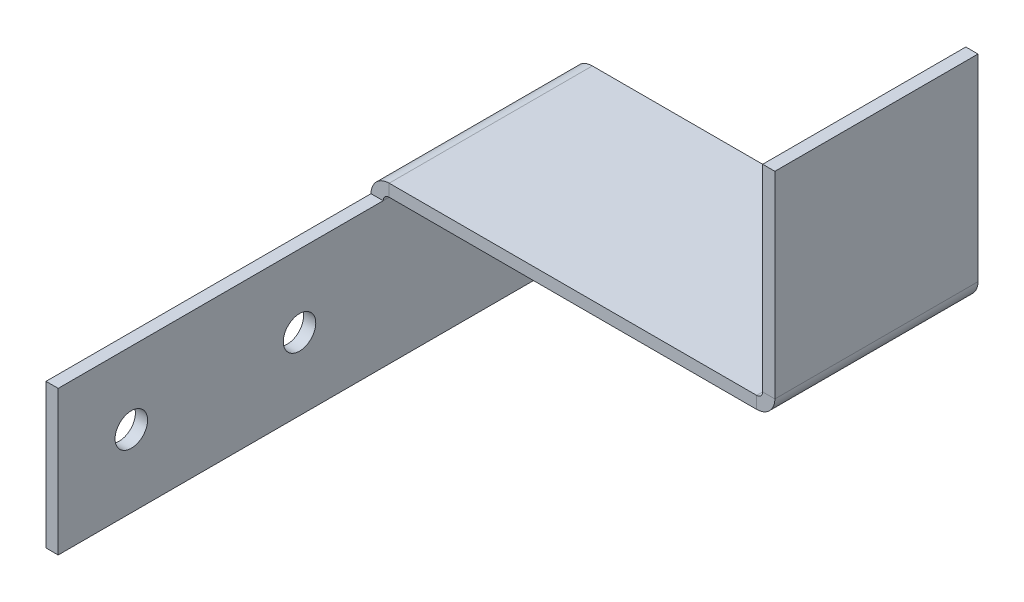
ISO-10303-21;
HEADER;
FILE_DESCRIPTION(('STEP AP214'),'2;1');
FILE_NAME('part.step','',(''),(''),'','','');
FILE_SCHEMA(('AUTOMOTIVE_DESIGN { 1 0 10303 214 1 1 1 1 }'));
ENDSEC;
DATA;
#1=APPLICATION_CONTEXT('core data for automotive mechanical design processes');
#2=APPLICATION_PROTOCOL_DEFINITION('international standard','automotive_design',2000,#1);
#3=PRODUCT_CONTEXT('',#1,'mechanical');
#4=PRODUCT('Part','Part','',(#3));
#5=PRODUCT_RELATED_PRODUCT_CATEGORY('part','',(#4));
#6=PRODUCT_DEFINITION_FORMATION('','',#4);
#7=PRODUCT_DEFINITION_CONTEXT('part definition',#1,'design');
#8=PRODUCT_DEFINITION('design','',#6,#7);
#9=PRODUCT_DEFINITION_SHAPE('','',#8);
#10=(LENGTH_UNIT() NAMED_UNIT(*) SI_UNIT(.MILLI.,.METRE.));
#11=(NAMED_UNIT(*) PLANE_ANGLE_UNIT() SI_UNIT($,.RADIAN.));
#12=(NAMED_UNIT(*) SI_UNIT($,.STERADIAN.) SOLID_ANGLE_UNIT());
#13=UNCERTAINTY_MEASURE_WITH_UNIT(LENGTH_MEASURE(1.E-05),#10,'distance_accuracy_value','');
#14=(GEOMETRIC_REPRESENTATION_CONTEXT(3) GLOBAL_UNCERTAINTY_ASSIGNED_CONTEXT((#13)) GLOBAL_UNIT_ASSIGNED_CONTEXT((#10,
#11,#12)) REPRESENTATION_CONTEXT('',''));
#15=CARTESIAN_POINT('',(0.,0.,0.));
#16=DIRECTION('',(0.,0.,1.));
#17=DIRECTION('',(1.,0.,0.));
#18=AXIS2_PLACEMENT_3D('',#15,#16,#17);
#19=CARTESIAN_POINT('',(9.99999999999997,-1.5,25.0000000000001));
#20=DIRECTION('',(0.,0.,1.));
#21=DIRECTION('',(-1.,0.,0.));
#22=AXIS2_PLACEMENT_3D('',#19,#20,#21);
#23=PLANE('',#22);
#24=DIRECTION('',(-1.,0.,0.));
#25=VECTOR('',#24,1.);
#26=CARTESIAN_POINT('',(9.99999999999997,0.,25.0000000000001));
#27=LINE('',#26,#25);
#28=CARTESIAN_POINT('',(47.4634,0.,25.0000000000001));
#29=VERTEX_POINT('',#28);
#30=CARTESIAN_POINT('',(2.23659999999993,0.,25.0000000000001));
#31=VERTEX_POINT('',#30);
#32=EDGE_CURVE('E41',#29,#31,#27,.T.);
#33=ORIENTED_EDGE('',*,*,#32,.T.);
#34=DIRECTION('',(0.,1.,0.));
#35=VECTOR('',#34,1.);
#36=CARTESIAN_POINT('',(2.23659999999994,-1.5,25.0000000000001));
#37=LINE('',#36,#35);
#38=CARTESIAN_POINT('',(2.23659999999994,-1.5,25.0000000000001));
#39=VERTEX_POINT('',#38);
#40=EDGE_CURVE('E186',#39,#31,#37,.T.);
#41=ORIENTED_EDGE('',*,*,#40,.F.);
#42=DIRECTION('',(-1.,0.,0.));
#43=VECTOR('',#42,1.);
#44=CARTESIAN_POINT('',(9.99999999999997,-1.5,25.0000000000001));
#45=LINE('',#44,#43);
#46=CARTESIAN_POINT('',(47.4634,-1.5,25.0000000000001));
#47=VERTEX_POINT('',#46);
#48=EDGE_CURVE('E46',#47,#39,#45,.T.);
#49=ORIENTED_EDGE('',*,*,#48,.F.);
#50=DIRECTION('',(0.,-1.,0.));
#51=VECTOR('',#50,1.);
#52=CARTESIAN_POINT('',(47.4634,0.,25.0000000000001));
#53=LINE('',#52,#51);
#54=EDGE_CURVE('E199',#29,#47,#53,.T.);
#55=ORIENTED_EDGE('',*,*,#54,.F.);
#56=EDGE_LOOP('',(#33,#41,#49,#55));
#57=FACE_BOUND('',#56,.T.);
#58=ADVANCED_FACE('F37',(#57),#23,.T.);
#59=CARTESIAN_POINT('',(0.,-1.5,0.));
#60=DIRECTION('',(0.,1.,0.));
#61=DIRECTION('',(0.,0.,-1.));
#62=AXIS2_PLACEMENT_3D('',#59,#60,#61);
#63=PLANE('',#62);
#64=DIRECTION('',(0.,0.,1.));
#65=VECTOR('',#64,1.);
#66=CARTESIAN_POINT('',(47.4634,-1.5,25.0000000000001));
#67=LINE('',#66,#65);
#68=CARTESIAN_POINT('',(47.4634,-1.5,0.));
#69=VERTEX_POINT('',#68);
#70=EDGE_CURVE('E289',#47,#69,#67,.F.);
#71=ORIENTED_EDGE('',*,*,#70,.F.);
#72=ORIENTED_EDGE('',*,*,#48,.T.);
#73=DIRECTION('',(0.,0.,1.));
#74=VECTOR('',#73,1.);
#75=CARTESIAN_POINT('',(2.23659999999994,-1.5,25.0000000000001));
#76=LINE('',#75,#74);
#77=CARTESIAN_POINT('',(2.23659999999994,-1.5,0.));
#78=VERTEX_POINT('',#77);
#79=EDGE_CURVE('E171',#39,#78,#76,.F.);
#80=ORIENTED_EDGE('',*,*,#79,.T.);
#81=DIRECTION('',(1.,0.,0.));
#82=VECTOR('',#81,1.);
#83=CARTESIAN_POINT('',(0.,-1.5,0.));
#84=LINE('',#83,#82);
#85=EDGE_CURVE('E11',#78,#69,#84,.T.);
#86=ORIENTED_EDGE('',*,*,#85,.T.);
#87=EDGE_LOOP('',(#71,#72,#80,#86));
#88=FACE_BOUND('',#87,.T.);
#89=ADVANCED_FACE('F312',(#88),#63,.F.);
#90=CARTESIAN_POINT('',(0.,0.,0.));
#91=DIRECTION('',(0.,1.,0.));
#92=DIRECTION('',(0.,0.,-1.));
#93=AXIS2_PLACEMENT_3D('',#90,#91,#92);
#94=PLANE('',#93);
#95=DIRECTION('',(1.,0.,0.));
#96=VECTOR('',#95,1.);
#97=CARTESIAN_POINT('',(0.,0.,0.));
#98=LINE('',#97,#96);
#99=CARTESIAN_POINT('',(2.23659999999994,0.,0.));
#100=VERTEX_POINT('',#99);
#101=CARTESIAN_POINT('',(47.4634,0.,0.));
#102=VERTEX_POINT('',#101);
#103=EDGE_CURVE('E185',#100,#102,#98,.T.);
#104=ORIENTED_EDGE('',*,*,#103,.F.);
#105=DIRECTION('',(0.,0.,1.));
#106=VECTOR('',#105,1.);
#107=CARTESIAN_POINT('',(2.23659999999993,0.,25.0000000000001));
#108=LINE('',#107,#106);
#109=EDGE_CURVE('E206',#31,#100,#108,.F.);
#110=ORIENTED_EDGE('',*,*,#109,.F.);
#111=ORIENTED_EDGE('',*,*,#32,.F.);
#112=DIRECTION('',(0.,0.,1.));
#113=VECTOR('',#112,1.);
#114=CARTESIAN_POINT('',(47.4634,0.,25.0000000000001));
#115=LINE('',#114,#113);
#116=EDGE_CURVE('E204',#29,#102,#115,.F.);
#117=ORIENTED_EDGE('',*,*,#116,.T.);
#118=EDGE_LOOP('',(#104,#110,#111,#117));
#119=FACE_BOUND('',#118,.T.);
#120=ADVANCED_FACE('F203',(#119),#94,.T.);
#121=CARTESIAN_POINT('',(0.,-1.5,0.));
#122=DIRECTION('',(0.,0.,-1.));
#123=DIRECTION('',(1.,0.,0.));
#124=AXIS2_PLACEMENT_3D('',#121,#122,#123);
#125=PLANE('',#124);
#126=DIRECTION('',(0.,-1.,0.));
#127=VECTOR('',#126,1.);
#128=CARTESIAN_POINT('',(47.4634,0.,0.));
#129=LINE('',#128,#127);
#130=EDGE_CURVE('E225',#102,#69,#129,.T.);
#131=ORIENTED_EDGE('',*,*,#130,.T.);
#132=ORIENTED_EDGE('',*,*,#85,.F.);
#133=DIRECTION('',(0.,1.,0.));
#134=VECTOR('',#133,1.);
#135=CARTESIAN_POINT('',(2.23659999999994,-1.5,0.));
#136=LINE('',#135,#134);
#137=EDGE_CURVE('E182',#78,#100,#136,.T.);
#138=ORIENTED_EDGE('',*,*,#137,.T.);
#139=ORIENTED_EDGE('',*,*,#103,.T.);
#140=EDGE_LOOP('',(#131,#132,#138,#139));
#141=FACE_BOUND('',#140,.T.);
#142=ADVANCED_FACE('F39',(#141),#125,.T.);
#143=CARTESIAN_POINT('',(2.23659999999994,-2.2366,0.));
#144=DIRECTION('',(0.,0.,-1.));
#145=DIRECTION('',(1.,0.,0.));
#146=AXIS2_PLACEMENT_3D('',#143,#144,#145);
#147=PLANE('',#146);
#148=DIRECTION('',(-1.,0.,0.));
#149=VECTOR('',#148,1.);
#150=CARTESIAN_POINT('',(0.,-2.23659999999999,0.));
#151=LINE('',#150,#149);
#152=CARTESIAN_POINT('',(1.49999999999994,-2.2366,0.));
#153=VERTEX_POINT('',#152);
#154=CARTESIAN_POINT('',(0.,-2.23659999999999,0.));
#155=VERTEX_POINT('',#154);
#156=EDGE_CURVE('E159',#153,#155,#151,.T.);
#157=ORIENTED_EDGE('',*,*,#156,.T.);
#158=CARTESIAN_POINT('',(2.23659999999994,-2.2366,0.));
#159=DIRECTION('',(0.,0.,-1.));
#160=DIRECTION('',(-1.,0.,0.));
#161=AXIS2_PLACEMENT_3D('',#158,#159,#160);
#162=CIRCLE('',#161,2.2366);
#163=EDGE_CURVE('E188',#100,#155,#162,.F.);
#164=ORIENTED_EDGE('',*,*,#163,.F.);
#165=ORIENTED_EDGE('',*,*,#137,.F.);
#166=CARTESIAN_POINT('',(2.23659999999994,-2.2366,0.));
#167=DIRECTION('',(0.,0.,-1.));
#168=DIRECTION('',(-1.,0.,0.));
#169=AXIS2_PLACEMENT_3D('',#166,#167,#168);
#170=CIRCLE('',#169,0.736599999999999);
#171=EDGE_CURVE('E175',#78,#153,#170,.F.);
#172=ORIENTED_EDGE('',*,*,#171,.T.);
#173=EDGE_LOOP('',(#157,#164,#165,#172));
#174=FACE_BOUND('',#173,.T.);
#175=ADVANCED_FACE('F217',(#174),#147,.T.);
#176=CARTESIAN_POINT('',(2.23659999999994,-2.2366,25.0000000000001));
#177=DIRECTION('',(0.,0.,-1.));
#178=DIRECTION('',(1.,0.,0.));
#179=AXIS2_PLACEMENT_3D('',#176,#177,#178);
#180=PLANE('',#179);
#181=CARTESIAN_POINT('',(2.23659999999994,-2.2366,25.0000000000001));
#182=DIRECTION('',(0.,0.,-1.));
#183=DIRECTION('',(-1.,0.,0.));
#184=AXIS2_PLACEMENT_3D('',#181,#182,#183);
#185=CIRCLE('',#184,0.736599999999999);
#186=CARTESIAN_POINT('',(1.49999999999999,-2.2366,25.0000000000001));
#187=VERTEX_POINT('',#186);
#188=EDGE_CURVE('E164',#187,#39,#185,.T.);
#189=ORIENTED_EDGE('',*,*,#188,.T.);
#190=ORIENTED_EDGE('',*,*,#40,.T.);
#191=CARTESIAN_POINT('',(2.23659999999994,-2.2366,25.0000000000001));
#192=DIRECTION('',(0.,0.,-1.));
#193=DIRECTION('',(-1.,0.,0.));
#194=AXIS2_PLACEMENT_3D('',#191,#192,#193);
#195=CIRCLE('',#194,2.2366);
#196=CARTESIAN_POINT('',(0.,-2.23659999999999,25.0000000000001));
#197=VERTEX_POINT('',#196);
#198=EDGE_CURVE('E166',#197,#31,#195,.T.);
#199=ORIENTED_EDGE('',*,*,#198,.F.);
#200=DIRECTION('',(-1.,0.,0.));
#201=VECTOR('',#200,1.);
#202=CARTESIAN_POINT('',(1.49999999999994,-2.2366,25.0000000000001));
#203=LINE('',#202,#201);
#204=EDGE_CURVE('E142',#187,#197,#203,.T.);
#205=ORIENTED_EDGE('',*,*,#204,.F.);
#206=EDGE_LOOP('',(#189,#190,#199,#205));
#207=FACE_BOUND('',#206,.T.);
#208=ADVANCED_FACE('F162',(#207),#180,.F.);
#209=CARTESIAN_POINT('',(2.23659999999994,-2.2366,25.0000000000001));
#210=DIRECTION('',(0.,0.,1.));
#211=DIRECTION('',(-1.,0.,0.));
#212=AXIS2_PLACEMENT_3D('',#209,#210,#211);
#213=CYLINDRICAL_SURFACE('',#212,2.2366);
#214=ORIENTED_EDGE('',*,*,#109,.T.);
#215=ORIENTED_EDGE('',*,*,#163,.T.);
#216=DIRECTION('',(0.,0.,1.));
#217=VECTOR('',#216,1.);
#218=CARTESIAN_POINT('',(0.,-2.23659999999999,0.));
#219=LINE('',#218,#217);
#220=EDGE_CURVE('E167',#155,#197,#219,.T.);
#221=ORIENTED_EDGE('',*,*,#220,.T.);
#222=ORIENTED_EDGE('',*,*,#198,.T.);
#223=EDGE_LOOP('',(#214,#215,#221,#222));
#224=FACE_BOUND('',#223,.T.);
#225=ADVANCED_FACE('F240',(#224),#213,.T.);
#226=CARTESIAN_POINT('',(2.23659999999994,-2.2366,25.0000000000001));
#227=DIRECTION('',(0.,0.,1.));
#228=DIRECTION('',(-1.,0.,0.));
#229=AXIS2_PLACEMENT_3D('',#226,#227,#228);
#230=CYLINDRICAL_SURFACE('',#229,0.736599999999999);
#231=ORIENTED_EDGE('',*,*,#79,.F.);
#232=ORIENTED_EDGE('',*,*,#188,.F.);
#233=DIRECTION('',(0.,0.,-1.));
#234=VECTOR('',#233,1.);
#235=CARTESIAN_POINT('',(1.49999999999994,-2.2366,0.));
#236=LINE('',#235,#234);
#237=EDGE_CURVE('E152',#153,#187,#236,.F.);
#238=ORIENTED_EDGE('',*,*,#237,.F.);
#239=ORIENTED_EDGE('',*,*,#171,.F.);
#240=EDGE_LOOP('',(#231,#232,#238,#239));
#241=FACE_BOUND('',#240,.T.);
#242=ADVANCED_FACE('F169',(#241),#230,.F.);
#243=CARTESIAN_POINT('',(-1.23599047663348E-13,-20.,0.));
#244=DIRECTION('',(0.,0.,-1.));
#245=DIRECTION('',(1.,0.,0.));
#246=AXIS2_PLACEMENT_3D('',#243,#244,#245);
#247=PLANE('',#246);
#248=DIRECTION('',(0.,1.,0.));
#249=VECTOR('',#248,1.);
#250=CARTESIAN_POINT('',(1.49999999999995,0.,0.));
#251=LINE('',#250,#249);
#252=CARTESIAN_POINT('',(1.49999999999988,-20.,0.));
#253=VERTEX_POINT('',#252);
#254=EDGE_CURVE('E155',#153,#253,#251,.F.);
#255=ORIENTED_EDGE('',*,*,#254,.T.);
#256=DIRECTION('',(1.,0.,0.));
#257=VECTOR('',#256,1.);
#258=CARTESIAN_POINT('',(-1.23599047663348E-13,-20.,0.));
#259=LINE('',#258,#257);
#260=CARTESIAN_POINT('',(-1.23602284087743E-13,-20.,0.));
#261=VERTEX_POINT('',#260);
#262=EDGE_CURVE('E173',#261,#253,#259,.T.);
#263=ORIENTED_EDGE('',*,*,#262,.F.);
#264=DIRECTION('',(0.,-1.,0.));
#265=VECTOR('',#264,1.);
#266=CARTESIAN_POINT('',(-1.23599047663348E-13,-20.,0.));
#267=LINE('',#266,#265);
#268=EDGE_CURVE('E223',#155,#261,#267,.T.);
#269=ORIENTED_EDGE('',*,*,#268,.F.);
#270=ORIENTED_EDGE('',*,*,#156,.F.);
#271=EDGE_LOOP('',(#255,#263,#269,#270));
#272=FACE_BOUND('',#271,.T.);
#273=ADVANCED_FACE('F220',(#272),#247,.T.);
#274=CARTESIAN_POINT('',(0.,0.,0.));
#275=DIRECTION('',(-1.,0.,0.));
#276=DIRECTION('',(0.,-1.,0.));
#277=AXIS2_PLACEMENT_3D('',#274,#275,#276);
#278=PLANE('',#277);
#279=CARTESIAN_POINT('',(0.,-11.1183,35.3000000000001));
#280=DIRECTION('',(1.,0.,0.));
#281=DIRECTION('',(0.,-1.,0.));
#282=AXIS2_PLACEMENT_3D('',#279,#280,#281);
#283=CIRCLE('',#282,2.);
#284=CARTESIAN_POINT('',(-1.026314053893E-13,-13.1183,35.3000000000001));
#285=VERTEX_POINT('',#284);
#286=EDGE_CURVE('E250',#285,#285,#283,.F.);
#287=ORIENTED_EDGE('',*,*,#286,.F.);
#288=EDGE_LOOP('',(#287));
#289=FACE_BOUND('',#288,.T.);
#290=CARTESIAN_POINT('',(0.,-11.1183,56.0000000000001));
#291=DIRECTION('',(1.,0.,0.));
#292=DIRECTION('',(0.,-1.,0.));
#293=AXIS2_PLACEMENT_3D('',#290,#291,#292);
#294=CIRCLE('',#293,2.);
#295=CARTESIAN_POINT('',(-1.04421397765085E-13,-13.1183,56.0000000000001));
#296=VERTEX_POINT('',#295);
#297=EDGE_CURVE('E601',#296,#296,#294,.F.);
#298=ORIENTED_EDGE('',*,*,#297,.F.);
#299=EDGE_LOOP('',(#298));
#300=FACE_BOUND('',#299,.T.);
#301=ORIENTED_EDGE('',*,*,#268,.T.);
#302=DIRECTION('',(0.,0.,1.));
#303=VECTOR('',#302,1.);
#304=CARTESIAN_POINT('',(-1.25767452008319E-13,-20.,25.0000000000001));
#305=LINE('',#304,#303);
#306=CARTESIAN_POINT('',(0.,-20.,65.0000000000001));
#307=VERTEX_POINT('',#306);
#308=EDGE_CURVE('E178',#261,#307,#305,.T.);
#309=ORIENTED_EDGE('',*,*,#308,.T.);
#310=DIRECTION('',(0.,-1.,0.));
#311=VECTOR('',#310,1.);
#312=CARTESIAN_POINT('',(0.,-2.2366,65.0000000000001));
#313=LINE('',#312,#311);
#314=CARTESIAN_POINT('',(0.,-2.2366,65.0000000000001));
#315=VERTEX_POINT('',#314);
#316=EDGE_CURVE('E149',#315,#307,#313,.T.);
#317=ORIENTED_EDGE('',*,*,#316,.F.);
#318=DIRECTION('',(0.,0.,1.));
#319=VECTOR('',#318,1.);
#320=CARTESIAN_POINT('',(0.,-2.23659999999999,25.0000000000001));
#321=LINE('',#320,#319);
#322=EDGE_CURVE('E244',#197,#315,#321,.T.);
#323=ORIENTED_EDGE('',*,*,#322,.F.);
#324=ORIENTED_EDGE('',*,*,#220,.F.);
#325=EDGE_LOOP('',(#301,#309,#317,#323,#324));
#326=FACE_BOUND('',#325,.T.);
#327=ADVANCED_FACE('F242',(#289,#300,#326),#278,.T.);
#328=CARTESIAN_POINT('',(1.49999999999995,0.,0.));
#329=DIRECTION('',(-1.,0.,0.));
#330=DIRECTION('',(0.,-1.,0.));
#331=AXIS2_PLACEMENT_3D('',#328,#329,#330);
#332=PLANE('',#331);
#333=CARTESIAN_POINT('',(1.4999999999999,-11.1183,35.3000000000001));
#334=DIRECTION('',(-1.,0.,0.));
#335=DIRECTION('',(0.,1.,0.));
#336=AXIS2_PLACEMENT_3D('',#333,#334,#335);
#337=CIRCLE('',#336,2.);
#338=CARTESIAN_POINT('',(1.49999999999991,-9.1183,35.3000000000001));
#339=VERTEX_POINT('',#338);
#340=EDGE_CURVE('E246',#339,#339,#337,.T.);
#341=ORIENTED_EDGE('',*,*,#340,.T.);
#342=EDGE_LOOP('',(#341));
#343=FACE_BOUND('',#342,.T.);
#344=CARTESIAN_POINT('',(1.4999999999999,-11.1183,56.0000000000001));
#345=DIRECTION('',(-1.,0.,0.));
#346=DIRECTION('',(0.,1.,0.));
#347=AXIS2_PLACEMENT_3D('',#344,#345,#346);
#348=CIRCLE('',#347,2.);
#349=CARTESIAN_POINT('',(1.49999999999991,-9.1183,56.0000000000001));
#350=VERTEX_POINT('',#349);
#351=EDGE_CURVE('E599',#350,#350,#348,.T.);
#352=ORIENTED_EDGE('',*,*,#351,.T.);
#353=EDGE_LOOP('',(#352));
#354=FACE_BOUND('',#353,.T.);
#355=ORIENTED_EDGE('',*,*,#237,.T.);
#356=DIRECTION('',(0.,0.,1.));
#357=VECTOR('',#356,1.);
#358=CARTESIAN_POINT('',(1.49999999999999,-2.2366,25.0000000000001));
#359=LINE('',#358,#357);
#360=CARTESIAN_POINT('',(1.49999999999999,-2.2366,65.0000000000001));
#361=VERTEX_POINT('',#360);
#362=EDGE_CURVE('E137',#187,#361,#359,.T.);
#363=ORIENTED_EDGE('',*,*,#362,.T.);
#364=DIRECTION('',(0.,-1.,0.));
#365=VECTOR('',#364,1.);
#366=CARTESIAN_POINT('',(1.49999999999999,-2.2366,65.0000000000001));
#367=LINE('',#366,#365);
#368=CARTESIAN_POINT('',(1.49999999999992,-20.,65.0000000000001));
#369=VERTEX_POINT('',#368);
#370=EDGE_CURVE('E148',#361,#369,#367,.T.);
#371=ORIENTED_EDGE('',*,*,#370,.T.);
#372=DIRECTION('',(0.,0.,-1.));
#373=VECTOR('',#372,1.);
#374=CARTESIAN_POINT('',(1.49999999999988,-20.,0.));
#375=LINE('',#374,#373);
#376=EDGE_CURVE('E235',#253,#369,#375,.F.);
#377=ORIENTED_EDGE('',*,*,#376,.F.);
#378=ORIENTED_EDGE('',*,*,#254,.F.);
#379=EDGE_LOOP('',(#355,#363,#371,#377,#378));
#380=FACE_BOUND('',#379,.T.);
#381=ADVANCED_FACE('F153',(#343,#354,#380),#332,.F.);
#382=CARTESIAN_POINT('',(-1.25767452008319E-13,-20.,25.0000000000001));
#383=DIRECTION('',(0.,-1.,0.));
#384=DIRECTION('',(1.,0.,0.));
#385=AXIS2_PLACEMENT_3D('',#382,#383,#384);
#386=PLANE('',#385);
#387=ORIENTED_EDGE('',*,*,#376,.T.);
#388=DIRECTION('',(-1.,0.,0.));
#389=VECTOR('',#388,1.);
#390=CARTESIAN_POINT('',(1.49999999999992,-20.,65.0000000000001));
#391=LINE('',#390,#389);
#392=EDGE_CURVE('E254',#369,#307,#391,.T.);
#393=ORIENTED_EDGE('',*,*,#392,.T.);
#394=ORIENTED_EDGE('',*,*,#308,.F.);
#395=ORIENTED_EDGE('',*,*,#262,.T.);
#396=EDGE_LOOP('',(#387,#393,#394,#395));
#397=FACE_BOUND('',#396,.T.);
#398=ADVANCED_FACE('F350',(#397),#386,.T.);
#399=CARTESIAN_POINT('',(47.4634,0.7366,0.));
#400=DIRECTION('',(0.,0.,-1.));
#401=DIRECTION('',(1.,0.,0.));
#402=AXIS2_PLACEMENT_3D('',#399,#400,#401);
#403=PLANE('',#402);
#404=DIRECTION('',(-1.,0.,0.));
#405=VECTOR('',#404,1.);
#406=CARTESIAN_POINT('',(49.7,0.736599999999992,0.));
#407=LINE('',#406,#405);
#408=CARTESIAN_POINT('',(48.2,0.736599999999997,0.));
#409=VERTEX_POINT('',#408);
#410=CARTESIAN_POINT('',(49.7,0.736599999999991,0.));
#411=VERTEX_POINT('',#410);
#412=EDGE_CURVE('E256',#409,#411,#407,.F.);
#413=ORIENTED_EDGE('',*,*,#412,.T.);
#414=CARTESIAN_POINT('',(47.4634,0.7366,0.));
#415=DIRECTION('',(0.,0.,-1.));
#416=DIRECTION('',(-1.,0.,0.));
#417=AXIS2_PLACEMENT_3D('',#414,#415,#416);
#418=CIRCLE('',#417,2.2366);
#419=EDGE_CURVE('E227',#69,#411,#418,.F.);
#420=ORIENTED_EDGE('',*,*,#419,.F.);
#421=ORIENTED_EDGE('',*,*,#130,.F.);
#422=CARTESIAN_POINT('',(47.4634,0.7366,0.));
#423=DIRECTION('',(0.,0.,-1.));
#424=DIRECTION('',(-1.,0.,0.));
#425=AXIS2_PLACEMENT_3D('',#422,#423,#424);
#426=CIRCLE('',#425,0.736599999999997);
#427=EDGE_CURVE('E61',#102,#409,#426,.F.);
#428=ORIENTED_EDGE('',*,*,#427,.T.);
#429=EDGE_LOOP('',(#413,#420,#421,#428));
#430=FACE_BOUND('',#429,.T.);
#431=ADVANCED_FACE('F298',(#430),#403,.T.);
#432=CARTESIAN_POINT('',(47.4634,0.7366,25.0000000000001));
#433=DIRECTION('',(0.,0.,-1.));
#434=DIRECTION('',(1.,0.,0.));
#435=AXIS2_PLACEMENT_3D('',#432,#433,#434);
#436=PLANE('',#435);
#437=CARTESIAN_POINT('',(47.4634,0.7366,25.0000000000001));
#438=DIRECTION('',(0.,0.,-1.));
#439=DIRECTION('',(-1.,0.,0.));
#440=AXIS2_PLACEMENT_3D('',#437,#438,#439);
#441=CIRCLE('',#440,0.736599999999997);
#442=CARTESIAN_POINT('',(48.2,0.736599999999997,25.0000000000001));
#443=VERTEX_POINT('',#442);
#444=EDGE_CURVE('E54',#443,#29,#441,.T.);
#445=ORIENTED_EDGE('',*,*,#444,.T.);
#446=ORIENTED_EDGE('',*,*,#54,.T.);
#447=CARTESIAN_POINT('',(47.4634,0.7366,25.0000000000001));
#448=DIRECTION('',(0.,0.,-1.));
#449=DIRECTION('',(-1.,0.,0.));
#450=AXIS2_PLACEMENT_3D('',#447,#448,#449);
#451=CIRCLE('',#450,2.2366);
#452=CARTESIAN_POINT('',(49.7,0.736599999999992,25.0000000000001));
#453=VERTEX_POINT('',#452);
#454=EDGE_CURVE('E292',#453,#47,#451,.T.);
#455=ORIENTED_EDGE('',*,*,#454,.F.);
#456=DIRECTION('',(-1.,0.,0.));
#457=VECTOR('',#456,1.);
#458=CARTESIAN_POINT('',(48.2,0.736599999999997,25.0000000000001));
#459=LINE('',#458,#457);
#460=EDGE_CURVE('E281',#443,#453,#459,.F.);
#461=ORIENTED_EDGE('',*,*,#460,.F.);
#462=EDGE_LOOP('',(#445,#446,#455,#461));
#463=FACE_BOUND('',#462,.T.);
#464=ADVANCED_FACE('F313',(#463),#436,.F.);
#465=CARTESIAN_POINT('',(47.4634,0.7366,25.0000000000001));
#466=DIRECTION('',(0.,0.,1.));
#467=DIRECTION('',(1.,0.,0.));
#468=AXIS2_PLACEMENT_3D('',#465,#466,#467);
#469=CYLINDRICAL_SURFACE('',#468,2.2366);
#470=ORIENTED_EDGE('',*,*,#70,.T.);
#471=ORIENTED_EDGE('',*,*,#419,.T.);
#472=DIRECTION('',(0.,0.,1.));
#473=VECTOR('',#472,1.);
#474=CARTESIAN_POINT('',(49.7,0.736599999999992,0.));
#475=LINE('',#474,#473);
#476=EDGE_CURVE('E278',#453,#411,#475,.F.);
#477=ORIENTED_EDGE('',*,*,#476,.F.);
#478=ORIENTED_EDGE('',*,*,#454,.T.);
#479=EDGE_LOOP('',(#470,#471,#477,#478));
#480=FACE_BOUND('',#479,.T.);
#481=ADVANCED_FACE('F308',(#480),#469,.T.);
#482=CARTESIAN_POINT('',(47.4634,0.7366,25.0000000000001));
#483=DIRECTION('',(0.,0.,1.));
#484=DIRECTION('',(1.,0.,0.));
#485=AXIS2_PLACEMENT_3D('',#482,#483,#484);
#486=CYLINDRICAL_SURFACE('',#485,0.736599999999997);
#487=ORIENTED_EDGE('',*,*,#116,.F.);
#488=ORIENTED_EDGE('',*,*,#444,.F.);
#489=DIRECTION('',(0.,0.,1.));
#490=VECTOR('',#489,1.);
#491=CARTESIAN_POINT('',(48.2,0.736599999999997,0.));
#492=LINE('',#491,#490);
#493=EDGE_CURVE('E284',#409,#443,#492,.T.);
#494=ORIENTED_EDGE('',*,*,#493,.F.);
#495=ORIENTED_EDGE('',*,*,#427,.F.);
#496=EDGE_LOOP('',(#487,#488,#494,#495));
#497=FACE_BOUND('',#496,.T.);
#498=ADVANCED_FACE('F315',(#497),#486,.F.);
#499=CARTESIAN_POINT('',(49.7000000000001,25.,25.0000000000001));
#500=DIRECTION('',(0.,0.,-1.));
#501=DIRECTION('',(1.,0.,0.));
#502=AXIS2_PLACEMENT_3D('',#499,#500,#501);
#503=PLANE('',#502);
#504=ORIENTED_EDGE('',*,*,#460,.T.);
#505=DIRECTION('',(0.,1.,0.));
#506=VECTOR('',#505,1.);
#507=CARTESIAN_POINT('',(49.7,-1.84565996060843E-13,25.0000000000001));
#508=LINE('',#507,#506);
#509=CARTESIAN_POINT('',(49.7000000000001,25.,25.0000000000001));
#510=VERTEX_POINT('',#509);
#511=EDGE_CURVE('E268',#453,#510,#508,.T.);
#512=ORIENTED_EDGE('',*,*,#511,.T.);
#513=DIRECTION('',(-1.,0.,0.));
#514=VECTOR('',#513,1.);
#515=CARTESIAN_POINT('',(49.7000000000001,25.,25.0000000000001));
#516=LINE('',#515,#514);
#517=CARTESIAN_POINT('',(48.2000000000001,25.,25.0000000000001));
#518=VERTEX_POINT('',#517);
#519=EDGE_CURVE('E258',#510,#518,#516,.T.);
#520=ORIENTED_EDGE('',*,*,#519,.T.);
#521=DIRECTION('',(0.,-1.,0.));
#522=VECTOR('',#521,1.);
#523=CARTESIAN_POINT('',(48.2000000000001,25.,25.0000000000001));
#524=LINE('',#523,#522);
#525=EDGE_CURVE('E275',#443,#518,#524,.F.);
#526=ORIENTED_EDGE('',*,*,#525,.F.);
#527=EDGE_LOOP('',(#504,#512,#520,#526));
#528=FACE_BOUND('',#527,.T.);
#529=ADVANCED_FACE('F321',(#528),#503,.F.);
#530=CARTESIAN_POINT('',(49.7,0.,0.));
#531=DIRECTION('',(0.,0.,1.));
#532=DIRECTION('',(-1.,0.,0.));
#533=AXIS2_PLACEMENT_3D('',#530,#531,#532);
#534=PLANE('',#533);
#535=ORIENTED_EDGE('',*,*,#412,.F.);
#536=DIRECTION('',(0.,1.,0.));
#537=VECTOR('',#536,1.);
#538=CARTESIAN_POINT('',(48.2,0.,0.));
#539=LINE('',#538,#537);
#540=CARTESIAN_POINT('',(48.2000000000001,25.,0.));
#541=VERTEX_POINT('',#540);
#542=EDGE_CURVE('E271',#541,#409,#539,.F.);
#543=ORIENTED_EDGE('',*,*,#542,.F.);
#544=DIRECTION('',(-1.,0.,0.));
#545=VECTOR('',#544,1.);
#546=CARTESIAN_POINT('',(49.7000000000001,25.,0.));
#547=LINE('',#546,#545);
#548=CARTESIAN_POINT('',(49.7000000000001,25.,0.));
#549=VERTEX_POINT('',#548);
#550=EDGE_CURVE('E261',#549,#541,#547,.T.);
#551=ORIENTED_EDGE('',*,*,#550,.F.);
#552=DIRECTION('',(0.,-1.,0.));
#553=VECTOR('',#552,1.);
#554=CARTESIAN_POINT('',(49.7,-1.84565996060843E-13,0.));
#555=LINE('',#554,#553);
#556=EDGE_CURVE('E264',#549,#411,#555,.T.);
#557=ORIENTED_EDGE('',*,*,#556,.T.);
#558=EDGE_LOOP('',(#535,#543,#551,#557));
#559=FACE_BOUND('',#558,.T.);
#560=ADVANCED_FACE('F301',(#559),#534,.F.);
#561=CARTESIAN_POINT('',(49.7,-1.84565996060843E-13,0.));
#562=DIRECTION('',(-1.,0.,0.));
#563=DIRECTION('',(0.,-1.,0.));
#564=AXIS2_PLACEMENT_3D('',#561,#562,#563);
#565=PLANE('',#564);
#566=ORIENTED_EDGE('',*,*,#476,.T.);
#567=ORIENTED_EDGE('',*,*,#556,.F.);
#568=DIRECTION('',(0.,0.,-1.));
#569=VECTOR('',#568,1.);
#570=CARTESIAN_POINT('',(49.7000000000001,25.,0.));
#571=LINE('',#570,#569);
#572=EDGE_CURVE('E266',#510,#549,#571,.T.);
#573=ORIENTED_EDGE('',*,*,#572,.F.);
#574=ORIENTED_EDGE('',*,*,#511,.F.);
#575=EDGE_LOOP('',(#566,#567,#573,#574));
#576=FACE_BOUND('',#575,.T.);
#577=ADVANCED_FACE('F306',(#576),#565,.F.);
#578=CARTESIAN_POINT('',(48.2,-1.79328774052578E-13,0.));
#579=DIRECTION('',(-1.,0.,0.));
#580=DIRECTION('',(0.,-1.,0.));
#581=AXIS2_PLACEMENT_3D('',#578,#579,#580);
#582=PLANE('',#581);
#583=ORIENTED_EDGE('',*,*,#525,.T.);
#584=DIRECTION('',(0.,0.,1.));
#585=VECTOR('',#584,1.);
#586=CARTESIAN_POINT('',(48.2000000000001,25.,0.));
#587=LINE('',#586,#585);
#588=EDGE_CURVE('E273',#518,#541,#587,.F.);
#589=ORIENTED_EDGE('',*,*,#588,.T.);
#590=ORIENTED_EDGE('',*,*,#542,.T.);
#591=ORIENTED_EDGE('',*,*,#493,.T.);
#592=EDGE_LOOP('',(#583,#589,#590,#591));
#593=FACE_BOUND('',#592,.T.);
#594=ADVANCED_FACE('F317',(#593),#582,.T.);
#595=CARTESIAN_POINT('',(49.7000000000001,25.,0.));
#596=DIRECTION('',(0.,-1.,0.));
#597=DIRECTION('',(1.,0.,0.));
#598=AXIS2_PLACEMENT_3D('',#595,#596,#597);
#599=PLANE('',#598);
#600=ORIENTED_EDGE('',*,*,#588,.F.);
#601=ORIENTED_EDGE('',*,*,#519,.F.);
#602=ORIENTED_EDGE('',*,*,#572,.T.);
#603=ORIENTED_EDGE('',*,*,#550,.T.);
#604=EDGE_LOOP('',(#600,#601,#602,#603));
#605=FACE_BOUND('',#604,.T.);
#606=ADVANCED_FACE('F320',(#605),#599,.F.);
#607=CARTESIAN_POINT('',(1.49999999999999,-2.2366,65.0000000000001));
#608=DIRECTION('',(0.,0.,1.));
#609=DIRECTION('',(-1.,0.,0.));
#610=AXIS2_PLACEMENT_3D('',#607,#608,#609);
#611=PLANE('',#610);
#612=ORIENTED_EDGE('',*,*,#316,.T.);
#613=ORIENTED_EDGE('',*,*,#392,.F.);
#614=ORIENTED_EDGE('',*,*,#370,.F.);
#615=DIRECTION('',(-1.,0.,0.));
#616=VECTOR('',#615,1.);
#617=CARTESIAN_POINT('',(1.49999999999999,-2.2366,65.0000000000001));
#618=LINE('',#617,#616);
#619=EDGE_CURVE('E144',#361,#315,#618,.T.);
#620=ORIENTED_EDGE('',*,*,#619,.T.);
#621=EDGE_LOOP('',(#612,#613,#614,#620));
#622=FACE_BOUND('',#621,.T.);
#623=ADVANCED_FACE('F412',(#622),#611,.T.);
#624=CARTESIAN_POINT('',(1.49999999999999,-2.2366,25.0000000000001));
#625=DIRECTION('',(0.,1.,0.));
#626=DIRECTION('',(-1.,0.,0.));
#627=AXIS2_PLACEMENT_3D('',#624,#625,#626);
#628=PLANE('',#627);
#629=ORIENTED_EDGE('',*,*,#322,.T.);
#630=ORIENTED_EDGE('',*,*,#619,.F.);
#631=ORIENTED_EDGE('',*,*,#362,.F.);
#632=ORIENTED_EDGE('',*,*,#204,.T.);
#633=EDGE_LOOP('',(#629,#630,#631,#632));
#634=FACE_BOUND('',#633,.T.);
#635=ADVANCED_FACE('F140',(#634),#628,.T.);
#636=CARTESIAN_POINT('',(-0.00100000000025427,-11.1183,56.0000000000001));
#637=DIRECTION('',(1.,0.,0.));
#638=DIRECTION('',(0.,1.,0.));
#639=AXIS2_PLACEMENT_3D('',#636,#637,#638);
#640=CYLINDRICAL_SURFACE('',#639,2.);
#641=ORIENTED_EDGE('',*,*,#297,.T.);
#642=EDGE_LOOP('',(#641));
#643=FACE_BOUND('',#642,.T.);
#644=ORIENTED_EDGE('',*,*,#351,.F.);
#645=EDGE_LOOP('',(#644));
#646=FACE_BOUND('',#645,.T.);
#647=ADVANCED_FACE('F431',(#643,#646),#640,.F.);
#648=CARTESIAN_POINT('',(-0.00100000000025253,-11.1183,35.3000000000001));
#649=DIRECTION('',(1.,0.,0.));
#650=DIRECTION('',(0.,1.,0.));
#651=AXIS2_PLACEMENT_3D('',#648,#649,#650);
#652=CYLINDRICAL_SURFACE('',#651,2.);
#653=ORIENTED_EDGE('',*,*,#286,.T.);
#654=EDGE_LOOP('',(#653));
#655=FACE_BOUND('',#654,.T.);
#656=ORIENTED_EDGE('',*,*,#340,.F.);
#657=EDGE_LOOP('',(#656));
#658=FACE_BOUND('',#657,.T.);
#659=ADVANCED_FACE('F441',(#655,#658),#652,.F.);
#660=CLOSED_SHELL('',(#58,#89,#120,#142,#175,#208,#225,#242,#273,#327,#381,#398,#431,#464,#481,
#498,#529,#560,#577,#594,#606,#623,#635,#647,#659));
#661=MANIFOLD_SOLID_BREP('B2',#660);
#662=ADVANCED_BREP_SHAPE_REPRESENTATION('',(#18,#661),#14);
#663=SHAPE_DEFINITION_REPRESENTATION(#9,#662);
ENDSEC;
END-ISO-10303-21;
